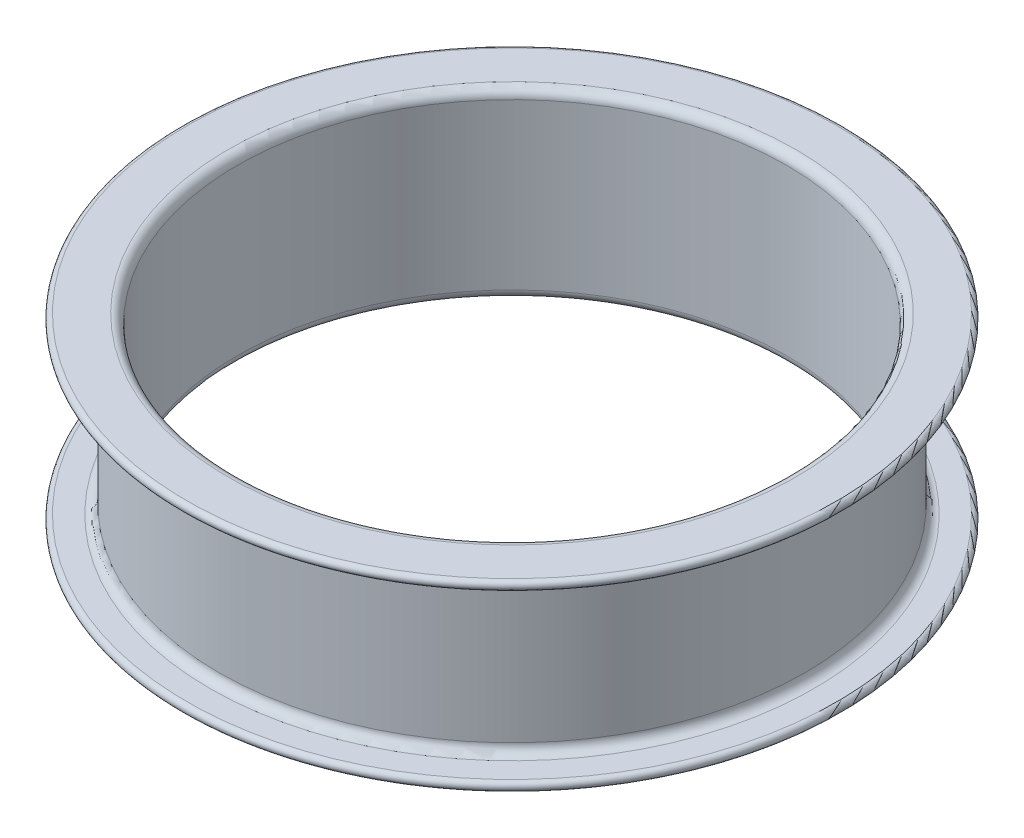
ISO-10303-21;
HEADER;
FILE_DESCRIPTION(('STEP AP214'),'2;1');
FILE_NAME('part.step','',(''),(''),'','','');
FILE_SCHEMA(('AUTOMOTIVE_DESIGN { 1 0 10303 214 1 1 1 1 }'));
ENDSEC;
DATA;
#1=APPLICATION_CONTEXT('core data for automotive mechanical design processes');
#2=APPLICATION_PROTOCOL_DEFINITION('international standard','automotive_design',2000,#1);
#3=PRODUCT_CONTEXT('',#1,'mechanical');
#4=PRODUCT('Part','Part','',(#3));
#5=PRODUCT_RELATED_PRODUCT_CATEGORY('part','',(#4));
#6=PRODUCT_DEFINITION_FORMATION('','',#4);
#7=PRODUCT_DEFINITION_CONTEXT('part definition',#1,'design');
#8=PRODUCT_DEFINITION('design','',#6,#7);
#9=PRODUCT_DEFINITION_SHAPE('','',#8);
#10=(LENGTH_UNIT() NAMED_UNIT(*) SI_UNIT(.MILLI.,.METRE.));
#11=(NAMED_UNIT(*) PLANE_ANGLE_UNIT() SI_UNIT($,.RADIAN.));
#12=(NAMED_UNIT(*) SI_UNIT($,.STERADIAN.) SOLID_ANGLE_UNIT());
#13=UNCERTAINTY_MEASURE_WITH_UNIT(LENGTH_MEASURE(1.E-05),#10,'distance_accuracy_value','');
#14=(GEOMETRIC_REPRESENTATION_CONTEXT(3) GLOBAL_UNCERTAINTY_ASSIGNED_CONTEXT((#13)) GLOBAL_UNIT_ASSIGNED_CONTEXT((#10,
#11,#12)) REPRESENTATION_CONTEXT('',''));
#15=CARTESIAN_POINT('',(0.,0.,0.));
#16=DIRECTION('',(0.,0.,1.));
#17=DIRECTION('',(1.,0.,0.));
#18=AXIS2_PLACEMENT_3D('',#15,#16,#17);
#19=CARTESIAN_POINT('',(0.,-4.75,0.));
#20=DIRECTION('',(0.,-1.,0.));
#21=DIRECTION('',(0.,0.,-1.));
#22=AXIS2_PLACEMENT_3D('',#19,#20,#21);
#23=TOROIDAL_SURFACE('',#22,17.75,0.25);
#24=CARTESIAN_POINT('',(0.,-4.5,0.));
#25=DIRECTION('',(0.,-1.,0.));
#26=DIRECTION('',(0.,0.,-1.));
#27=AXIS2_PLACEMENT_3D('',#24,#25,#26);
#28=CIRCLE('',#27,17.75);
#29=CARTESIAN_POINT('',(0.,-4.5,-17.75));
#30=VERTEX_POINT('',#29);
#31=EDGE_CURVE('E55',#30,#30,#28,.F.);
#32=ORIENTED_EDGE('',*,*,#31,.F.);
#33=EDGE_LOOP('',(#32));
#34=FACE_BOUND('',#33,.T.);
#35=CARTESIAN_POINT('',(0.,-5.,0.));
#36=DIRECTION('',(0.,1.,0.));
#37=DIRECTION('',(0.,0.,1.));
#38=AXIS2_PLACEMENT_3D('',#35,#36,#37);
#39=CIRCLE('',#38,17.75);
#40=CARTESIAN_POINT('',(0.,-5.,17.75));
#41=VERTEX_POINT('',#40);
#42=EDGE_CURVE('E10',#41,#41,#39,.F.);
#43=ORIENTED_EDGE('',*,*,#42,.F.);
#44=EDGE_LOOP('',(#43));
#45=FACE_BOUND('',#44,.T.);
#46=ADVANCED_FACE('F44',(#34,#45),#23,.T.);
#47=CARTESIAN_POINT('',(0.,4.75,0.));
#48=DIRECTION('',(0.,-1.,0.));
#49=DIRECTION('',(0.,0.,-1.));
#50=AXIS2_PLACEMENT_3D('',#47,#48,#49);
#51=TOROIDAL_SURFACE('',#50,17.75,0.25);
#52=CARTESIAN_POINT('',(0.,5.,0.));
#53=DIRECTION('',(0.,-1.,0.));
#54=DIRECTION('',(0.,0.,-1.));
#55=AXIS2_PLACEMENT_3D('',#52,#53,#54);
#56=CIRCLE('',#55,17.75);
#57=CARTESIAN_POINT('',(0.,5.,-17.75));
#58=VERTEX_POINT('',#57);
#59=EDGE_CURVE('E58',#58,#58,#56,.F.);
#60=ORIENTED_EDGE('',*,*,#59,.F.);
#61=EDGE_LOOP('',(#60));
#62=FACE_BOUND('',#61,.T.);
#63=CARTESIAN_POINT('',(0.,4.5,0.));
#64=DIRECTION('',(0.,1.,0.));
#65=DIRECTION('',(0.,0.,1.));
#66=AXIS2_PLACEMENT_3D('',#63,#64,#65);
#67=CIRCLE('',#66,17.75);
#68=CARTESIAN_POINT('',(0.,4.5,17.75));
#69=VERTEX_POINT('',#68);
#70=EDGE_CURVE('E57',#69,#69,#67,.F.);
#71=ORIENTED_EDGE('',*,*,#70,.F.);
#72=EDGE_LOOP('',(#71));
#73=FACE_BOUND('',#72,.T.);
#74=ADVANCED_FACE('F115',(#62,#73),#51,.T.);
#75=CARTESIAN_POINT('',(0.,-17.2756697847607,0.));
#76=DIRECTION('',(0.,-1.,0.));
#77=DIRECTION('',(0.,0.,-1.));
#78=AXIS2_PLACEMENT_3D('',#75,#76,#77);
#79=CYLINDRICAL_SURFACE('',#78,15.);
#80=CARTESIAN_POINT('',(0.,4.5,0.));
#81=DIRECTION('',(0.,-1.,0.));
#82=DIRECTION('',(0.,0.,-1.));
#83=AXIS2_PLACEMENT_3D('',#80,#81,#82);
#84=CIRCLE('',#83,15.);
#85=CARTESIAN_POINT('',(0.,4.5,-15.));
#86=VERTEX_POINT('',#85);
#87=EDGE_CURVE('E72',#86,#86,#84,.F.);
#88=ORIENTED_EDGE('',*,*,#87,.T.);
#89=EDGE_LOOP('',(#88));
#90=FACE_BOUND('',#89,.T.);
#91=CARTESIAN_POINT('',(0.,-4.5,0.));
#92=DIRECTION('',(0.,1.,0.));
#93=DIRECTION('',(0.,0.,1.));
#94=AXIS2_PLACEMENT_3D('',#91,#92,#93);
#95=CIRCLE('',#94,15.);
#96=CARTESIAN_POINT('',(0.,-4.5,15.));
#97=VERTEX_POINT('',#96);
#98=EDGE_CURVE('E74',#97,#97,#95,.F.);
#99=ORIENTED_EDGE('',*,*,#98,.T.);
#100=EDGE_LOOP('',(#99));
#101=FACE_BOUND('',#100,.T.);
#102=ADVANCED_FACE('F117',(#90,#101),#79,.F.);
#103=CARTESIAN_POINT('',(0.,-5.,15.));
#104=DIRECTION('',(0.,1.,0.));
#105=DIRECTION('',(0.,0.,1.));
#106=AXIS2_PLACEMENT_3D('',#103,#104,#105);
#107=PLANE('',#106);
#108=ORIENTED_EDGE('',*,*,#42,.T.);
#109=EDGE_LOOP('',(#108));
#110=FACE_BOUND('',#109,.T.);
#111=CARTESIAN_POINT('',(0.,-5.,0.));
#112=DIRECTION('',(0.,1.,0.));
#113=DIRECTION('',(0.,0.,1.));
#114=AXIS2_PLACEMENT_3D('',#111,#112,#113);
#115=CIRCLE('',#114,15.5);
#116=CARTESIAN_POINT('',(0.,-5.,15.5));
#117=VERTEX_POINT('',#116);
#118=EDGE_CURVE('E61',#117,#117,#115,.T.);
#119=ORIENTED_EDGE('',*,*,#118,.T.);
#120=EDGE_LOOP('',(#119));
#121=FACE_BOUND('',#120,.T.);
#122=ADVANCED_FACE('F127',(#110,#121),#107,.F.);
#123=CARTESIAN_POINT('',(0.,-4.5,18.));
#124=DIRECTION('',(0.,-1.,0.));
#125=DIRECTION('',(0.,0.,-1.));
#126=AXIS2_PLACEMENT_3D('',#123,#124,#125);
#127=PLANE('',#126);
#128=ORIENTED_EDGE('',*,*,#31,.T.);
#129=EDGE_LOOP('',(#128));
#130=FACE_BOUND('',#129,.T.);
#131=CARTESIAN_POINT('',(0.,-4.5,0.));
#132=DIRECTION('',(0.,-1.,0.));
#133=DIRECTION('',(0.,0.,-1.));
#134=AXIS2_PLACEMENT_3D('',#131,#132,#133);
#135=CIRCLE('',#134,16.5);
#136=CARTESIAN_POINT('',(0.,-4.5,-16.5));
#137=VERTEX_POINT('',#136);
#138=EDGE_CURVE('E88',#137,#137,#135,.T.);
#139=ORIENTED_EDGE('',*,*,#138,.T.);
#140=EDGE_LOOP('',(#139));
#141=FACE_BOUND('',#140,.T.);
#142=ADVANCED_FACE('F89',(#130,#141),#127,.F.);
#143=CARTESIAN_POINT('',(0.,-17.2756697847607,0.));
#144=DIRECTION('',(0.,-1.,0.));
#145=DIRECTION('',(0.,0.,-1.));
#146=AXIS2_PLACEMENT_3D('',#143,#144,#145);
#147=CYLINDRICAL_SURFACE('',#146,16.);
#148=CARTESIAN_POINT('',(0.,-4.,0.));
#149=DIRECTION('',(0.,-1.,0.));
#150=DIRECTION('',(0.,0.,-1.));
#151=AXIS2_PLACEMENT_3D('',#148,#149,#150);
#152=CIRCLE('',#151,16.);
#153=CARTESIAN_POINT('',(0.,-4.,-16.));
#154=VERTEX_POINT('',#153);
#155=EDGE_CURVE('E76',#154,#154,#152,.F.);
#156=ORIENTED_EDGE('',*,*,#155,.T.);
#157=EDGE_LOOP('',(#156));
#158=FACE_BOUND('',#157,.T.);
#159=CARTESIAN_POINT('',(0.,4.,0.));
#160=DIRECTION('',(0.,1.,0.));
#161=DIRECTION('',(0.,0.,1.));
#162=AXIS2_PLACEMENT_3D('',#159,#160,#161);
#163=CIRCLE('',#162,16.);
#164=CARTESIAN_POINT('',(0.,4.,16.));
#165=VERTEX_POINT('',#164);
#166=EDGE_CURVE('E82',#165,#165,#163,.F.);
#167=ORIENTED_EDGE('',*,*,#166,.T.);
#168=EDGE_LOOP('',(#167));
#169=FACE_BOUND('',#168,.T.);
#170=ADVANCED_FACE('F144',(#158,#169),#147,.T.);
#171=CARTESIAN_POINT('',(0.,4.5,16.));
#172=DIRECTION('',(0.,1.,0.));
#173=DIRECTION('',(0.,0.,1.));
#174=AXIS2_PLACEMENT_3D('',#171,#172,#173);
#175=PLANE('',#174);
#176=ORIENTED_EDGE('',*,*,#70,.T.);
#177=EDGE_LOOP('',(#176));
#178=FACE_BOUND('',#177,.T.);
#179=CARTESIAN_POINT('',(0.,4.5,0.));
#180=DIRECTION('',(0.,1.,0.));
#181=DIRECTION('',(0.,0.,1.));
#182=AXIS2_PLACEMENT_3D('',#179,#180,#181);
#183=CIRCLE('',#182,16.5);
#184=CARTESIAN_POINT('',(0.,4.5,16.5));
#185=VERTEX_POINT('',#184);
#186=EDGE_CURVE('E67',#185,#185,#183,.T.);
#187=ORIENTED_EDGE('',*,*,#186,.T.);
#188=EDGE_LOOP('',(#187));
#189=FACE_BOUND('',#188,.T.);
#190=ADVANCED_FACE('F106',(#178,#189),#175,.F.);
#191=CARTESIAN_POINT('',(0.,5.,18.));
#192=DIRECTION('',(0.,-1.,0.));
#193=DIRECTION('',(0.,0.,-1.));
#194=AXIS2_PLACEMENT_3D('',#191,#192,#193);
#195=PLANE('',#194);
#196=ORIENTED_EDGE('',*,*,#59,.T.);
#197=EDGE_LOOP('',(#196));
#198=FACE_BOUND('',#197,.T.);
#199=CARTESIAN_POINT('',(0.,5.,0.));
#200=DIRECTION('',(0.,-1.,0.));
#201=DIRECTION('',(0.,0.,-1.));
#202=AXIS2_PLACEMENT_3D('',#199,#200,#201);
#203=CIRCLE('',#202,15.5);
#204=CARTESIAN_POINT('',(0.,5.,-15.5));
#205=VERTEX_POINT('',#204);
#206=EDGE_CURVE('E79',#205,#205,#203,.T.);
#207=ORIENTED_EDGE('',*,*,#206,.T.);
#208=EDGE_LOOP('',(#207));
#209=FACE_BOUND('',#208,.T.);
#210=ADVANCED_FACE('F92',(#198,#209),#195,.F.);
#211=CARTESIAN_POINT('',(0.,-4.,0.));
#212=DIRECTION('',(0.,-1.,0.));
#213=DIRECTION('',(0.,0.,-1.));
#214=AXIS2_PLACEMENT_3D('',#211,#212,#213);
#215=TOROIDAL_SURFACE('',#214,16.5,0.5);
#216=ORIENTED_EDGE('',*,*,#155,.F.);
#217=EDGE_LOOP('',(#216));
#218=FACE_BOUND('',#217,.T.);
#219=ORIENTED_EDGE('',*,*,#138,.F.);
#220=EDGE_LOOP('',(#219));
#221=FACE_BOUND('',#220,.T.);
#222=ADVANCED_FACE('F95',(#218,#221),#215,.F.);
#223=CARTESIAN_POINT('',(0.,4.5,0.));
#224=DIRECTION('',(0.,-1.,0.));
#225=DIRECTION('',(0.,0.,-1.));
#226=AXIS2_PLACEMENT_3D('',#223,#224,#225);
#227=TOROIDAL_SURFACE('',#226,15.5,0.5);
#228=ORIENTED_EDGE('',*,*,#87,.F.);
#229=EDGE_LOOP('',(#228));
#230=FACE_BOUND('',#229,.T.);
#231=ORIENTED_EDGE('',*,*,#206,.F.);
#232=EDGE_LOOP('',(#231));
#233=FACE_BOUND('',#232,.T.);
#234=ADVANCED_FACE('F94',(#230,#233),#227,.T.);
#235=CARTESIAN_POINT('',(0.,4.,0.));
#236=DIRECTION('',(0.,1.,0.));
#237=DIRECTION('',(0.,0.,1.));
#238=AXIS2_PLACEMENT_3D('',#235,#236,#237);
#239=TOROIDAL_SURFACE('',#238,16.5,0.5);
#240=ORIENTED_EDGE('',*,*,#186,.F.);
#241=EDGE_LOOP('',(#240));
#242=FACE_BOUND('',#241,.T.);
#243=ORIENTED_EDGE('',*,*,#166,.F.);
#244=EDGE_LOOP('',(#243));
#245=FACE_BOUND('',#244,.T.);
#246=ADVANCED_FACE('F105',(#242,#245),#239,.F.);
#247=CARTESIAN_POINT('',(0.,-4.5,0.));
#248=DIRECTION('',(0.,1.,0.));
#249=DIRECTION('',(0.,0.,1.));
#250=AXIS2_PLACEMENT_3D('',#247,#248,#249);
#251=TOROIDAL_SURFACE('',#250,15.5,0.5);
#252=ORIENTED_EDGE('',*,*,#118,.F.);
#253=EDGE_LOOP('',(#252));
#254=FACE_BOUND('',#253,.T.);
#255=ORIENTED_EDGE('',*,*,#98,.F.);
#256=EDGE_LOOP('',(#255));
#257=FACE_BOUND('',#256,.T.);
#258=ADVANCED_FACE('F135',(#254,#257),#251,.T.);
#259=CLOSED_SHELL('',(#46,#74,#102,#122,#142,#170,#190,#210,#222,#234,#246,#258));
#260=MANIFOLD_SOLID_BREP('B2',#259);
#261=ADVANCED_BREP_SHAPE_REPRESENTATION('',(#18,#260),#14);
#262=SHAPE_DEFINITION_REPRESENTATION(#9,#261);
ENDSEC;
END-ISO-10303-21;
